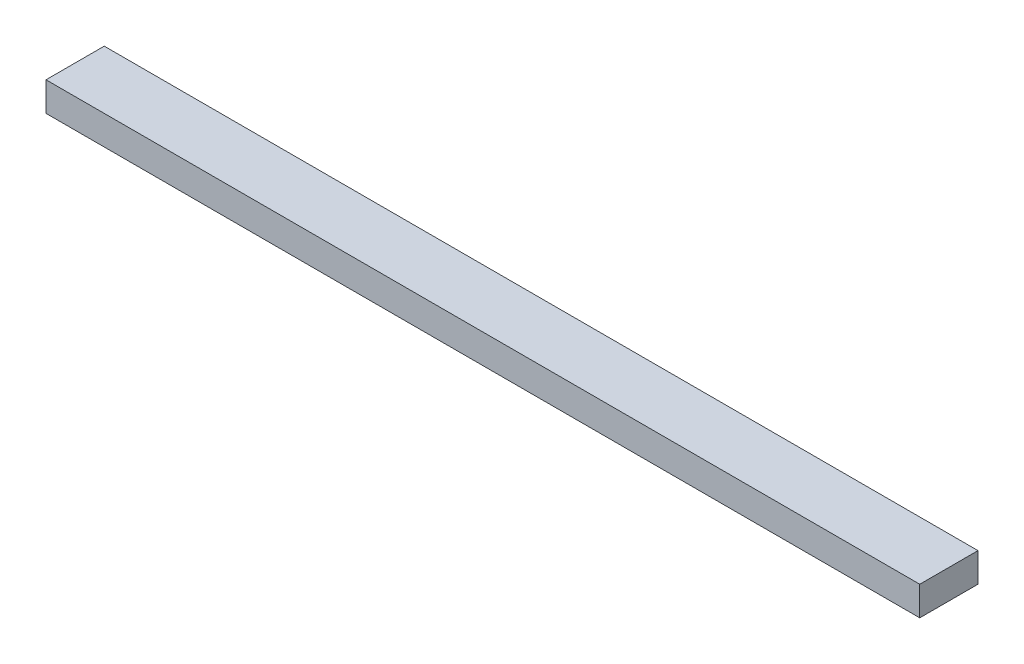
ISO-10303-21;
HEADER;
FILE_DESCRIPTION(('STEP AP214'),'2;1');
FILE_NAME('part.step','',(''),(''),'','','');
FILE_SCHEMA(('AUTOMOTIVE_DESIGN { 1 0 10303 214 1 1 1 1 }'));
ENDSEC;
DATA;
#1=APPLICATION_CONTEXT('core data for automotive mechanical design processes');
#2=APPLICATION_PROTOCOL_DEFINITION('international standard','automotive_design',2000,#1);
#3=PRODUCT_CONTEXT('',#1,'mechanical');
#4=PRODUCT('Part','Part','',(#3));
#5=PRODUCT_RELATED_PRODUCT_CATEGORY('part','',(#4));
#6=PRODUCT_DEFINITION_FORMATION('','',#4);
#7=PRODUCT_DEFINITION_CONTEXT('part definition',#1,'design');
#8=PRODUCT_DEFINITION('design','',#6,#7);
#9=PRODUCT_DEFINITION_SHAPE('','',#8);
#10=(LENGTH_UNIT() NAMED_UNIT(*) SI_UNIT(.MILLI.,.METRE.));
#11=(NAMED_UNIT(*) PLANE_ANGLE_UNIT() SI_UNIT($,.RADIAN.));
#12=(NAMED_UNIT(*) SI_UNIT($,.STERADIAN.) SOLID_ANGLE_UNIT());
#13=UNCERTAINTY_MEASURE_WITH_UNIT(LENGTH_MEASURE(1.E-05),#10,'distance_accuracy_value','');
#14=(GEOMETRIC_REPRESENTATION_CONTEXT(3) GLOBAL_UNCERTAINTY_ASSIGNED_CONTEXT((#13)) GLOBAL_UNIT_ASSIGNED_CONTEXT((#10,
#11,#12)) REPRESENTATION_CONTEXT('',''));
#15=CARTESIAN_POINT('',(0.,0.,0.));
#16=DIRECTION('',(0.,0.,1.));
#17=DIRECTION('',(1.,0.,0.));
#18=AXIS2_PLACEMENT_3D('',#15,#16,#17);
#19=CARTESIAN_POINT('',(15.,1.,1.));
#20=DIRECTION('',(-1.,0.,0.));
#21=DIRECTION('',(0.,0.,1.));
#22=AXIS2_PLACEMENT_3D('',#19,#20,#21);
#23=PLANE('',#22);
#24=DIRECTION('',(0.,0.,-1.));
#25=VECTOR('',#24,1.);
#26=CARTESIAN_POINT('',(15.,0.,1.));
#27=LINE('',#26,#25);
#28=CARTESIAN_POINT('',(15.,0.,1.));
#29=VERTEX_POINT('',#28);
#30=CARTESIAN_POINT('',(15.,0.,-1.));
#31=VERTEX_POINT('',#30);
#32=EDGE_CURVE('E107',#29,#31,#27,.T.);
#33=ORIENTED_EDGE('',*,*,#32,.T.);
#34=DIRECTION('',(0.,-1.,0.));
#35=VECTOR('',#34,1.);
#36=CARTESIAN_POINT('',(15.,1.,-1.));
#37=LINE('',#36,#35);
#38=CARTESIAN_POINT('',(15.,1.,-1.));
#39=VERTEX_POINT('',#38);
#40=EDGE_CURVE('E11',#39,#31,#37,.T.);
#41=ORIENTED_EDGE('',*,*,#40,.F.);
#42=DIRECTION('',(0.,0.,-1.));
#43=VECTOR('',#42,1.);
#44=CARTESIAN_POINT('',(15.,1.,1.));
#45=LINE('',#44,#43);
#46=CARTESIAN_POINT('',(15.,1.,1.));
#47=VERTEX_POINT('',#46);
#48=EDGE_CURVE('E91',#47,#39,#45,.T.);
#49=ORIENTED_EDGE('',*,*,#48,.F.);
#50=DIRECTION('',(0.,-1.,0.));
#51=VECTOR('',#50,1.);
#52=CARTESIAN_POINT('',(15.,1.,1.));
#53=LINE('',#52,#51);
#54=EDGE_CURVE('E103',#47,#29,#53,.T.);
#55=ORIENTED_EDGE('',*,*,#54,.T.);
#56=EDGE_LOOP('',(#33,#41,#49,#55));
#57=FACE_BOUND('',#56,.T.);
#58=ADVANCED_FACE('F39',(#57),#23,.F.);
#59=CARTESIAN_POINT('',(-15.,1.,-1.));
#60=DIRECTION('',(0.,0.,1.));
#61=DIRECTION('',(1.,0.,0.));
#62=AXIS2_PLACEMENT_3D('',#59,#60,#61);
#63=PLANE('',#62);
#64=DIRECTION('',(-1.,0.,0.));
#65=VECTOR('',#64,1.);
#66=CARTESIAN_POINT('',(-15.,0.,-1.));
#67=LINE('',#66,#65);
#68=CARTESIAN_POINT('',(-15.,0.,-1.));
#69=VERTEX_POINT('',#68);
#70=EDGE_CURVE('E96',#31,#69,#67,.T.);
#71=ORIENTED_EDGE('',*,*,#70,.T.);
#72=DIRECTION('',(0.,-1.,0.));
#73=VECTOR('',#72,1.);
#74=CARTESIAN_POINT('',(-15.,1.,-1.));
#75=LINE('',#74,#73);
#76=CARTESIAN_POINT('',(-15.,1.,-1.));
#77=VERTEX_POINT('',#76);
#78=EDGE_CURVE('E48',#77,#69,#75,.T.);
#79=ORIENTED_EDGE('',*,*,#78,.F.);
#80=DIRECTION('',(-1.,0.,0.));
#81=VECTOR('',#80,1.);
#82=CARTESIAN_POINT('',(-15.,1.,-1.));
#83=LINE('',#82,#81);
#84=EDGE_CURVE('E86',#39,#77,#83,.T.);
#85=ORIENTED_EDGE('',*,*,#84,.F.);
#86=ORIENTED_EDGE('',*,*,#40,.T.);
#87=EDGE_LOOP('',(#71,#79,#85,#86));
#88=FACE_BOUND('',#87,.T.);
#89=ADVANCED_FACE('F95',(#88),#63,.F.);
#90=CARTESIAN_POINT('',(-15.,1.,1.));
#91=DIRECTION('',(1.,0.,0.));
#92=DIRECTION('',(0.,0.,-1.));
#93=AXIS2_PLACEMENT_3D('',#90,#91,#92);
#94=PLANE('',#93);
#95=DIRECTION('',(0.,0.,1.));
#96=VECTOR('',#95,1.);
#97=CARTESIAN_POINT('',(-15.,0.,1.));
#98=LINE('',#97,#96);
#99=CARTESIAN_POINT('',(-15.,0.,1.));
#100=VERTEX_POINT('',#99);
#101=EDGE_CURVE('E73',#69,#100,#98,.T.);
#102=ORIENTED_EDGE('',*,*,#101,.T.);
#103=DIRECTION('',(0.,-1.,0.));
#104=VECTOR('',#103,1.);
#105=CARTESIAN_POINT('',(-15.,1.,1.));
#106=LINE('',#105,#104);
#107=CARTESIAN_POINT('',(-15.,1.,1.));
#108=VERTEX_POINT('',#107);
#109=EDGE_CURVE('E98',#108,#100,#106,.T.);
#110=ORIENTED_EDGE('',*,*,#109,.F.);
#111=DIRECTION('',(0.,0.,1.));
#112=VECTOR('',#111,1.);
#113=CARTESIAN_POINT('',(-15.,1.,1.));
#114=LINE('',#113,#112);
#115=EDGE_CURVE('E89',#77,#108,#114,.T.);
#116=ORIENTED_EDGE('',*,*,#115,.F.);
#117=ORIENTED_EDGE('',*,*,#78,.T.);
#118=EDGE_LOOP('',(#102,#110,#116,#117));
#119=FACE_BOUND('',#118,.T.);
#120=ADVANCED_FACE('F99',(#119),#94,.F.);
#121=CARTESIAN_POINT('',(-15.,1.,1.));
#122=DIRECTION('',(0.,0.,-1.));
#123=DIRECTION('',(-1.,0.,0.));
#124=AXIS2_PLACEMENT_3D('',#121,#122,#123);
#125=PLANE('',#124);
#126=DIRECTION('',(1.,0.,0.));
#127=VECTOR('',#126,1.);
#128=CARTESIAN_POINT('',(-15.,0.,1.));
#129=LINE('',#128,#127);
#130=EDGE_CURVE('E79',#100,#29,#129,.T.);
#131=ORIENTED_EDGE('',*,*,#130,.T.);
#132=ORIENTED_EDGE('',*,*,#54,.F.);
#133=DIRECTION('',(1.,0.,0.));
#134=VECTOR('',#133,1.);
#135=CARTESIAN_POINT('',(-15.,1.,1.));
#136=LINE('',#135,#134);
#137=EDGE_CURVE('E56',#108,#47,#136,.T.);
#138=ORIENTED_EDGE('',*,*,#137,.F.);
#139=ORIENTED_EDGE('',*,*,#109,.T.);
#140=EDGE_LOOP('',(#131,#132,#138,#139));
#141=FACE_BOUND('',#140,.T.);
#142=ADVANCED_FACE('F120',(#141),#125,.F.);
#143=CARTESIAN_POINT('',(0.,1.,0.));
#144=DIRECTION('',(0.,-1.,0.));
#145=DIRECTION('',(0.,0.,-1.));
#146=AXIS2_PLACEMENT_3D('',#143,#144,#145);
#147=PLANE('',#146);
#148=ORIENTED_EDGE('',*,*,#48,.T.);
#149=ORIENTED_EDGE('',*,*,#84,.T.);
#150=ORIENTED_EDGE('',*,*,#115,.T.);
#151=ORIENTED_EDGE('',*,*,#137,.T.);
#152=EDGE_LOOP('',(#148,#149,#150,#151));
#153=FACE_BOUND('',#152,.T.);
#154=ADVANCED_FACE('F87',(#153),#147,.F.);
#155=CARTESIAN_POINT('',(0.,0.,0.));
#156=DIRECTION('',(0.,-1.,0.));
#157=DIRECTION('',(0.,0.,-1.));
#158=AXIS2_PLACEMENT_3D('',#155,#156,#157);
#159=PLANE('',#158);
#160=ORIENTED_EDGE('',*,*,#32,.F.);
#161=ORIENTED_EDGE('',*,*,#130,.F.);
#162=ORIENTED_EDGE('',*,*,#101,.F.);
#163=ORIENTED_EDGE('',*,*,#70,.F.);
#164=EDGE_LOOP('',(#160,#161,#162,#163));
#165=FACE_BOUND('',#164,.T.);
#166=ADVANCED_FACE('F123',(#165),#159,.T.);
#167=CLOSED_SHELL('',(#58,#89,#120,#142,#154,#166));
#168=MANIFOLD_SOLID_BREP('B2',#167);
#169=ADVANCED_BREP_SHAPE_REPRESENTATION('',(#18,#168),#14);
#170=SHAPE_DEFINITION_REPRESENTATION(#9,#169);
ENDSEC;
END-ISO-10303-21;
